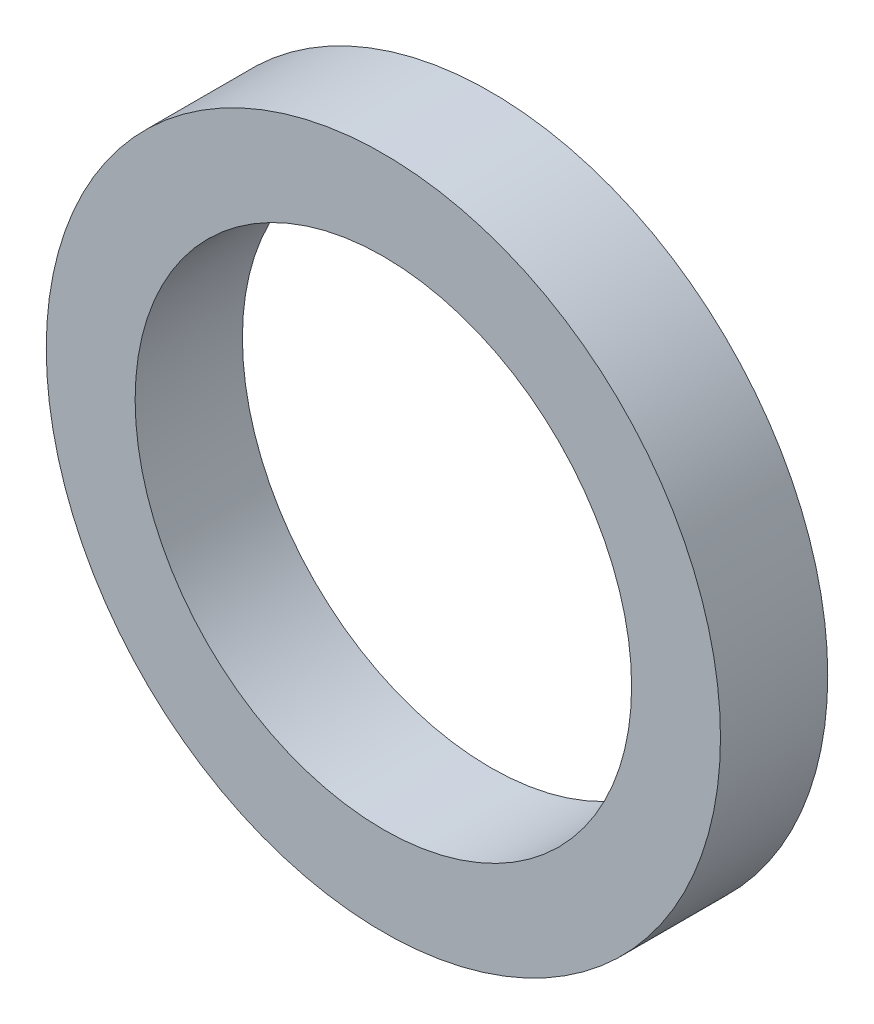
ISO-10303-21;
HEADER;
FILE_DESCRIPTION(('STEP AP214'),'2;1');
FILE_NAME('part.step','',(''),(''),'','','');
FILE_SCHEMA(('AUTOMOTIVE_DESIGN { 1 0 10303 214 1 1 1 1 }'));
ENDSEC;
DATA;
#1=APPLICATION_CONTEXT('core data for automotive mechanical design processes');
#2=APPLICATION_PROTOCOL_DEFINITION('international standard','automotive_design',2000,#1);
#3=PRODUCT_CONTEXT('',#1,'mechanical');
#4=PRODUCT('Part','Part','',(#3));
#5=PRODUCT_RELATED_PRODUCT_CATEGORY('part','',(#4));
#6=PRODUCT_DEFINITION_FORMATION('','',#4);
#7=PRODUCT_DEFINITION_CONTEXT('part definition',#1,'design');
#8=PRODUCT_DEFINITION('design','',#6,#7);
#9=PRODUCT_DEFINITION_SHAPE('','',#8);
#10=(LENGTH_UNIT() NAMED_UNIT(*) SI_UNIT(.MILLI.,.METRE.));
#11=(NAMED_UNIT(*) PLANE_ANGLE_UNIT() SI_UNIT($,.RADIAN.));
#12=(NAMED_UNIT(*) SI_UNIT($,.STERADIAN.) SOLID_ANGLE_UNIT());
#13=UNCERTAINTY_MEASURE_WITH_UNIT(LENGTH_MEASURE(1.E-05),#10,'distance_accuracy_value','');
#14=(GEOMETRIC_REPRESENTATION_CONTEXT(3) GLOBAL_UNCERTAINTY_ASSIGNED_CONTEXT((#13)) GLOBAL_UNIT_ASSIGNED_CONTEXT((#10,
#11,#12)) REPRESENTATION_CONTEXT('',''));
#15=CARTESIAN_POINT('',(0.,0.,0.));
#16=DIRECTION('',(0.,0.,1.));
#17=DIRECTION('',(1.,0.,0.));
#18=AXIS2_PLACEMENT_3D('',#15,#16,#17);
#19=CARTESIAN_POINT('',(11.,0.,3.5));
#20=DIRECTION('',(0.,0.,1.));
#21=DIRECTION('',(1.,0.,0.));
#22=AXIS2_PLACEMENT_3D('',#19,#20,#21);
#23=PLANE('',#22);
#24=CARTESIAN_POINT('',(0.,0.,3.5));
#25=DIRECTION('',(0.,0.,-1.));
#26=DIRECTION('',(-1.,0.,0.));
#27=AXIS2_PLACEMENT_3D('',#24,#25,#26);
#28=CIRCLE('',#27,8.1);
#29=CARTESIAN_POINT('',(-8.1,0.,3.5));
#30=VERTEX_POINT('',#29);
#31=EDGE_CURVE('E10',#30,#30,#28,.T.);
#32=ORIENTED_EDGE('',*,*,#31,.T.);
#33=EDGE_LOOP('',(#32));
#34=FACE_BOUND('',#33,.T.);
#35=CARTESIAN_POINT('',(0.,0.,3.5));
#36=DIRECTION('',(0.,0.,-1.));
#37=DIRECTION('',(-1.,0.,0.));
#38=AXIS2_PLACEMENT_3D('',#35,#36,#37);
#39=CIRCLE('',#38,11.);
#40=CARTESIAN_POINT('',(-11.,0.,3.5));
#41=VERTEX_POINT('',#40);
#42=EDGE_CURVE('E48',#41,#41,#39,.T.);
#43=ORIENTED_EDGE('',*,*,#42,.F.);
#44=EDGE_LOOP('',(#43));
#45=FACE_BOUND('',#44,.T.);
#46=ADVANCED_FACE('F34',(#34,#45),#23,.T.);
#47=CARTESIAN_POINT('',(0.,0.,3.5));
#48=DIRECTION('',(0.,0.,-1.));
#49=DIRECTION('',(-1.,0.,0.));
#50=AXIS2_PLACEMENT_3D('',#47,#48,#49);
#51=CYLINDRICAL_SURFACE('',#50,8.1);
#52=CARTESIAN_POINT('',(0.,0.,0.));
#53=DIRECTION('',(0.,0.,-1.));
#54=DIRECTION('',(-1.,0.,0.));
#55=AXIS2_PLACEMENT_3D('',#52,#53,#54);
#56=CIRCLE('',#55,8.1);
#57=CARTESIAN_POINT('',(-8.1,0.,0.));
#58=VERTEX_POINT('',#57);
#59=EDGE_CURVE('E40',#58,#58,#56,.T.);
#60=ORIENTED_EDGE('',*,*,#59,.T.);
#61=EDGE_LOOP('',(#60));
#62=FACE_BOUND('',#61,.T.);
#63=ORIENTED_EDGE('',*,*,#31,.F.);
#64=EDGE_LOOP('',(#63));
#65=FACE_BOUND('',#64,.T.);
#66=ADVANCED_FACE('F58',(#62,#65),#51,.F.);
#67=CARTESIAN_POINT('',(8.1,0.,0.));
#68=DIRECTION('',(0.,0.,-1.));
#69=DIRECTION('',(-1.,0.,0.));
#70=AXIS2_PLACEMENT_3D('',#67,#68,#69);
#71=PLANE('',#70);
#72=CARTESIAN_POINT('',(0.,0.,0.));
#73=DIRECTION('',(0.,0.,-1.));
#74=DIRECTION('',(-1.,0.,0.));
#75=AXIS2_PLACEMENT_3D('',#72,#73,#74);
#76=CIRCLE('',#75,11.);
#77=CARTESIAN_POINT('',(-11.,0.,0.));
#78=VERTEX_POINT('',#77);
#79=EDGE_CURVE('E44',#78,#78,#76,.T.);
#80=ORIENTED_EDGE('',*,*,#79,.T.);
#81=EDGE_LOOP('',(#80));
#82=FACE_BOUND('',#81,.T.);
#83=ORIENTED_EDGE('',*,*,#59,.F.);
#84=EDGE_LOOP('',(#83));
#85=FACE_BOUND('',#84,.T.);
#86=ADVANCED_FACE('F62',(#82,#85),#71,.T.);
#87=CARTESIAN_POINT('',(0.,0.,3.5));
#88=DIRECTION('',(0.,0.,-1.));
#89=DIRECTION('',(-1.,0.,0.));
#90=AXIS2_PLACEMENT_3D('',#87,#88,#89);
#91=CYLINDRICAL_SURFACE('',#90,11.);
#92=ORIENTED_EDGE('',*,*,#42,.T.);
#93=EDGE_LOOP('',(#92));
#94=FACE_BOUND('',#93,.T.);
#95=ORIENTED_EDGE('',*,*,#79,.F.);
#96=EDGE_LOOP('',(#95));
#97=FACE_BOUND('',#96,.T.);
#98=ADVANCED_FACE('F54',(#94,#97),#91,.T.);
#99=CLOSED_SHELL('',(#46,#66,#86,#98));
#100=MANIFOLD_SOLID_BREP('B2',#99);
#101=ADVANCED_BREP_SHAPE_REPRESENTATION('',(#18,#100),#14);
#102=SHAPE_DEFINITION_REPRESENTATION(#9,#101);
ENDSEC;
END-ISO-10303-21;
